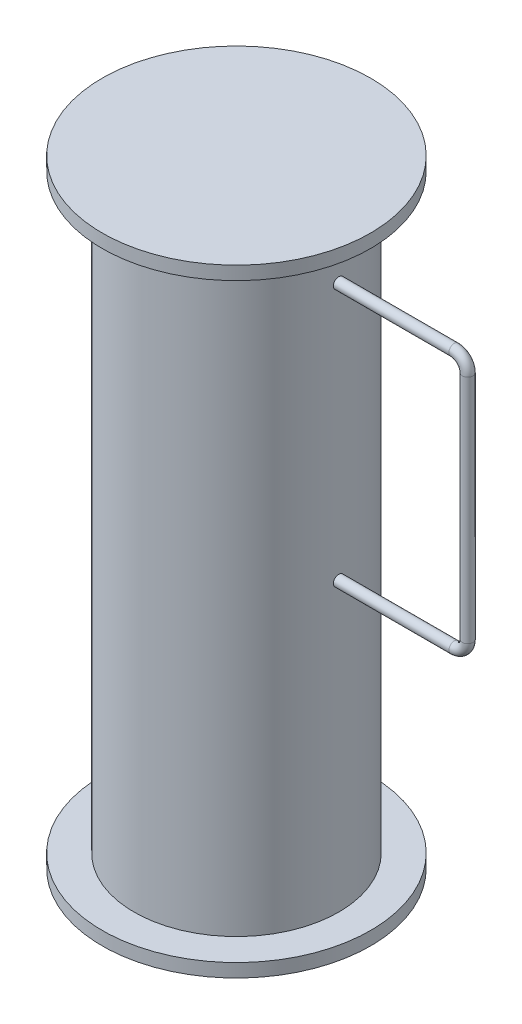
ISO-10303-21;
HEADER;
FILE_DESCRIPTION(('STEP AP214'),'2;1');
FILE_NAME('part.step','',(''),(''),'','','');
FILE_SCHEMA(('AUTOMOTIVE_DESIGN { 1 0 10303 214 1 1 1 1 }'));
ENDSEC;
DATA;
#1=APPLICATION_CONTEXT('core data for automotive mechanical design processes');
#2=APPLICATION_PROTOCOL_DEFINITION('international standard','automotive_design',2000,#1);
#3=PRODUCT_CONTEXT('',#1,'mechanical');
#4=PRODUCT('Part','Part','',(#3));
#5=PRODUCT_RELATED_PRODUCT_CATEGORY('part','',(#4));
#6=PRODUCT_DEFINITION_FORMATION('','',#4);
#7=PRODUCT_DEFINITION_CONTEXT('part definition',#1,'design');
#8=PRODUCT_DEFINITION('design','',#6,#7);
#9=PRODUCT_DEFINITION_SHAPE('','',#8);
#10=(LENGTH_UNIT() NAMED_UNIT(*) SI_UNIT(.MILLI.,.METRE.));
#11=(NAMED_UNIT(*) PLANE_ANGLE_UNIT() SI_UNIT($,.RADIAN.));
#12=(NAMED_UNIT(*) SI_UNIT($,.STERADIAN.) SOLID_ANGLE_UNIT());
#13=UNCERTAINTY_MEASURE_WITH_UNIT(LENGTH_MEASURE(1.E-05),#10,'distance_accuracy_value','');
#14=(GEOMETRIC_REPRESENTATION_CONTEXT(3) GLOBAL_UNCERTAINTY_ASSIGNED_CONTEXT((#13)) GLOBAL_UNIT_ASSIGNED_CONTEXT((#10,
#11,#12)) REPRESENTATION_CONTEXT('',''));
#15=CARTESIAN_POINT('',(0.,0.,0.));
#16=DIRECTION('',(0.,0.,1.));
#17=DIRECTION('',(1.,0.,0.));
#18=AXIS2_PLACEMENT_3D('',#15,#16,#17);
#19=CARTESIAN_POINT('',(-38.15,200.,0.));
#20=DIRECTION('',(1.,0.,0.));
#21=DIRECTION('',(0.,0.,1.));
#22=AXIS2_PLACEMENT_3D('',#19,#20,#21);
#23=PLANE('',#22);
#24=CARTESIAN_POINT('',(-38.15,200.,0.));
#25=DIRECTION('',(1.,0.,0.));
#26=DIRECTION('',(0.,0.,1.));
#27=AXIS2_PLACEMENT_3D('',#24,#25,#26);
#28=CIRCLE('',#27,2.);
#29=CARTESIAN_POINT('',(-38.15,200.,2.));
#30=VERTEX_POINT('',#29);
#31=EDGE_CURVE('E66',#30,#30,#28,.T.);
#32=ORIENTED_EDGE('',*,*,#31,.T.);
#33=EDGE_LOOP('',(#32));
#34=FACE_BOUND('',#33,.T.);
#35=ADVANCED_FACE('F54',(#34),#23,.T.);
#36=CARTESIAN_POINT('',(-38.15,180.,0.));
#37=DIRECTION('',(-1.,0.,0.));
#38=DIRECTION('',(0.,0.,1.));
#39=AXIS2_PLACEMENT_3D('',#36,#37,#38);
#40=PLANE('',#39);
#41=CARTESIAN_POINT('',(-38.15,180.,0.));
#42=DIRECTION('',(-1.,0.,0.));
#43=DIRECTION('',(0.,0.,1.));
#44=AXIS2_PLACEMENT_3D('',#41,#42,#43);
#45=CIRCLE('',#44,2.);
#46=CARTESIAN_POINT('',(-38.15,180.,2.));
#47=VERTEX_POINT('',#46);
#48=EDGE_CURVE('E13',#47,#47,#45,.T.);
#49=ORIENTED_EDGE('',*,*,#48,.F.);
#50=EDGE_LOOP('',(#49));
#51=FACE_BOUND('',#50,.T.);
#52=ADVANCED_FACE('F72',(#51),#40,.F.);
#53=CARTESIAN_POINT('',(-38.15,200.,0.));
#54=DIRECTION('',(-1.,0.,0.));
#55=DIRECTION('',(0.,-1.,0.));
#56=AXIS2_PLACEMENT_3D('',#53,#54,#55);
#57=CYLINDRICAL_SURFACE('',#56,2.);
#58=CARTESIAN_POINT('',(-48.15,200.,0.));
#59=DIRECTION('',(1.,0.,0.));
#60=DIRECTION('',(0.,0.,1.));
#61=AXIS2_PLACEMENT_3D('',#58,#59,#60);
#62=CIRCLE('',#61,2.);
#63=CARTESIAN_POINT('',(-48.15,202.,0.));
#64=VERTEX_POINT('',#63);
#65=EDGE_CURVE('E97',#64,#64,#62,.T.);
#66=ORIENTED_EDGE('',*,*,#65,.T.);
#67=EDGE_LOOP('',(#66));
#68=FACE_BOUND('',#67,.T.);
#69=ORIENTED_EDGE('',*,*,#31,.F.);
#70=EDGE_LOOP('',(#69));
#71=FACE_BOUND('',#70,.T.);
#72=ADVANCED_FACE('F74',(#68,#71),#57,.T.);
#73=CARTESIAN_POINT('',(-48.15,190.,0.));
#74=DIRECTION('',(0.,0.,1.));
#75=DIRECTION('',(1.,0.,0.));
#76=AXIS2_PLACEMENT_3D('',#73,#74,#75);
#77=TOROIDAL_SURFACE('',#76,10.,2.);
#78=CARTESIAN_POINT('',(-48.1500000000004,180.,0.));
#79=DIRECTION('',(-1.,0.,0.));
#80=DIRECTION('',(0.,0.,1.));
#81=AXIS2_PLACEMENT_3D('',#78,#79,#80);
#82=CIRCLE('',#81,2.);
#83=CARTESIAN_POINT('',(-48.1500000000005,178.,0.));
#84=VERTEX_POINT('',#83);
#85=EDGE_CURVE('E61',#84,#84,#82,.T.);
#86=CARTESIAN_POINT('',(-48.15,190.,0.));
#87=DIRECTION('',(0.,0.,1.));
#88=DIRECTION('',(1.,0.,0.));
#89=AXIS2_PLACEMENT_3D('',#86,#87,#88);
#90=CIRCLE('',#89,12.);
#91=EDGE_CURVE('',#64,#84,#90,.T.);
#92=ORIENTED_EDGE('',*,*,#65,.F.);
#93=ORIENTED_EDGE('',*,*,#85,.T.);
#94=ORIENTED_EDGE('',*,*,#91,.T.);
#95=ORIENTED_EDGE('',*,*,#91,.F.);
#96=EDGE_LOOP('',(#92,#94,#93,#95));
#97=FACE_BOUND('',#96,.T.);
#98=ADVANCED_FACE('F79',(#97),#77,.T.);
#99=CARTESIAN_POINT('',(-48.15,180.,0.));
#100=DIRECTION('',(1.,0.,0.));
#101=DIRECTION('',(0.,0.,-1.));
#102=AXIS2_PLACEMENT_3D('',#99,#100,#101);
#103=CYLINDRICAL_SURFACE('',#102,2.);
#104=ORIENTED_EDGE('',*,*,#48,.T.);
#105=EDGE_LOOP('',(#104));
#106=FACE_BOUND('',#105,.T.);
#107=ORIENTED_EDGE('',*,*,#85,.F.);
#108=EDGE_LOOP('',(#107));
#109=FACE_BOUND('',#108,.T.);
#110=ADVANCED_FACE('F69',(#106,#109),#103,.T.);
#111=CLOSED_SHELL('',(#35,#52,#72,#98,#110));
#112=MANIFOLD_SOLID_BREP('B2',#111);
#113=CARTESIAN_POINT('',(0.,0.,0.));
#114=DIRECTION('',(0.,-1.,0.));
#115=DIRECTION('',(0.,0.,-1.));
#116=AXIS2_PLACEMENT_3D('',#113,#114,#115);
#117=CYLINDRICAL_SURFACE('',#116,38.15);
#118=CARTESIAN_POINT('',(38.15,110.,0.));
#119=CARTESIAN_POINT('',(38.1499992993985,110.000004951731,0.112258148685077));
#120=CARTESIAN_POINT('',(38.149499207453,110.009483165388,0.22459572954906));
#121=CARTESIAN_POINT('',(38.1475523185728,110.047158934401,0.446171383502218));
#122=CARTESIAN_POINT('',(38.146104408624,110.075378498124,0.555405654855379));
#123=CARTESIAN_POINT('',(38.1424257484339,110.149726333528,0.76753292154806));
#124=CARTESIAN_POINT('',(38.1401953996838,110.195845421755,0.87042913734669));
#125=CARTESIAN_POINT('',(38.1352029930976,110.304668904109,1.0669918329576));
#126=CARTESIAN_POINT('',(38.1324410601568,110.367369403742,1.16066047297956));
#127=CARTESIAN_POINT('',(38.1266927567493,110.507652119338,1.33623951081285));
#128=CARTESIAN_POINT('',(38.1237061731681,110.585248577425,1.41813852349931));
#129=CARTESIAN_POINT('',(38.1178470084383,110.75309187874,1.56775639641275));
#130=CARTESIAN_POINT('',(38.1149744319692,110.843339240542,1.6354746750725));
#131=CARTESIAN_POINT('',(38.1096656733204,111.033983401005,1.75484106769072));
#132=CARTESIAN_POINT('',(38.1072297365196,111.134385857275,1.80648015754536));
#133=CARTESIAN_POINT('',(38.1030715876673,111.342450360097,1.89216447140918));
#134=CARTESIAN_POINT('',(38.1013493698017,111.450112347504,1.92620983874255));
#135=CARTESIAN_POINT('',(38.0988148213587,111.66953386995,1.97570984629501));
#136=CARTESIAN_POINT('',(38.0980016477617,111.781289509144,1.99118171199299));
#137=CARTESIAN_POINT('',(38.0973743585714,112.005814447169,2.00314867927228));
#138=CARTESIAN_POINT('',(38.0975602344886,112.118583737378,1.99964394210901));
#139=CARTESIAN_POINT('',(38.0989092999511,112.341817736564,1.97377152757986));
#140=CARTESIAN_POINT('',(38.1000715249619,112.452284609763,1.95142246642401));
#141=CARTESIAN_POINT('',(38.1032407786439,112.667896635843,1.88852466563318));
#142=CARTESIAN_POINT('',(38.1052478111492,112.77304176457,1.84797584340078));
#143=CARTESIAN_POINT('',(38.1098815867728,112.975085563919,1.74980831446508));
#144=CARTESIAN_POINT('',(38.1125086376132,113.071980107084,1.69218112793573));
#145=CARTESIAN_POINT('',(38.1180860505435,113.254727115159,1.56149886585028));
#146=CARTESIAN_POINT('',(38.1210364151542,113.340579493965,1.48844367000317));
#147=CARTESIAN_POINT('',(38.1269322156884,113.498913484652,1.32887413997164));
#148=CARTESIAN_POINT('',(38.1298776413825,113.571378852894,1.24234368655388));
#149=CARTESIAN_POINT('',(38.1354281697442,113.700756605569,1.05833654795718));
#150=CARTESIAN_POINT('',(38.1380332723227,113.757668985926,0.960859859908013));
#151=CARTESIAN_POINT('',(38.142609692942,113.854323704403,0.757717692900043));
#152=CARTESIAN_POINT('',(38.144580989744,113.89406546715,0.652051939671517));
#153=CARTESIAN_POINT('',(38.1476673313215,113.955240169134,0.435535352678438));
#154=CARTESIAN_POINT('',(38.1487823831408,113.976673258984,0.324684561575481));
#155=CARTESIAN_POINT('',(38.1500296642226,114.00060216922,0.101085547634998));
#156=CARTESIAN_POINT('',(38.1501630594521,114.003120455822,-0.0116602647206608));
#157=CARTESIAN_POINT('',(38.1494350905306,113.989206916625,-0.235972833257903));
#158=CARTESIAN_POINT('',(38.1485737300022,113.972775159835,-0.347539593731743));
#159=CARTESIAN_POINT('',(38.1459540085655,113.921446567151,-0.566264074884137));
#160=CARTESIAN_POINT('',(38.1441961464192,113.886559998053,-0.673424211371209));
#161=CARTESIAN_POINT('',(38.1399813070339,113.799322494233,-0.880368005452287));
#162=CARTESIAN_POINT('',(38.137524325368,113.746971448926,-0.98015161633387));
#163=CARTESIAN_POINT('',(38.1321846830358,113.626233585456,-1.16961297710345));
#164=CARTESIAN_POINT('',(38.1293016237997,113.557831717122,-1.2592811245866));
#165=CARTESIAN_POINT('',(38.1234358049953,113.406955859806,-1.42586963909338));
#166=CARTESIAN_POINT('',(38.1204530447272,113.324481772056,-1.50278991663639));
#167=CARTESIAN_POINT('',(38.1147206743867,113.147705915324,-1.64177492607588));
#168=CARTESIAN_POINT('',(38.1119712942391,113.053392704084,-1.70382511526345));
#169=CARTESIAN_POINT('',(38.1070193448234,112.855673565821,-1.81120916296373));
#170=CARTESIAN_POINT('',(38.1048167729992,112.752267681305,-1.85654309961924));
#171=CARTESIAN_POINT('',(38.1012084615101,112.539352253302,-1.92918245144076));
#172=CARTESIAN_POINT('',(38.0998023130581,112.429845872832,-1.95649711670216));
#173=CARTESIAN_POINT('',(38.0979442696772,112.207793732481,-1.99235280874951));
#174=CARTESIAN_POINT('',(38.0974923686169,112.095247992134,-2.00089395616323));
#175=CARTESIAN_POINT('',(38.0975939306772,111.870456618204,-1.99895902166349));
#176=CARTESIAN_POINT('',(38.0981461844963,111.758210786455,-1.98850581462103));
#177=CARTESIAN_POINT('',(38.1001912584329,111.537070085528,-1.94892621026606));
#178=CARTESIAN_POINT('',(38.1016840803291,111.428175222687,-1.91979977764154));
#179=CARTESIAN_POINT('',(38.1054417650773,111.216823073362,-1.84370528842257));
#180=CARTESIAN_POINT('',(38.1077066319461,111.114365820375,-1.79673713900031));
#181=CARTESIAN_POINT('',(38.1127530795484,110.918789343397,-1.68629622147943));
#182=CARTESIAN_POINT('',(38.1155346448645,110.825669840913,-1.62282394580986));
#183=CARTESIAN_POINT('',(38.1213048344701,110.651297492004,-1.48109392959055));
#184=CARTESIAN_POINT('',(38.1242936818809,110.570057734815,-1.40282009496846));
#185=CARTESIAN_POINT('',(38.1301399228911,110.421845792055,-1.2337222635245));
#186=CARTESIAN_POINT('',(38.1329972840026,110.354877117926,-1.14289518698329));
#187=CARTESIAN_POINT('',(38.1382607233009,110.237073873706,-0.951192199062935));
#188=CARTESIAN_POINT('',(38.1406663441514,110.186255618455,-0.850306260677778));
#189=CARTESIAN_POINT('',(38.14474854063,110.102339784369,-0.641496663967942));
#190=CARTESIAN_POINT('',(38.1464259756478,110.069221305894,-0.533581475430962));
#191=CARTESIAN_POINT('',(38.1484198332582,110.030318205232,-0.354164664958992));
#192=CARTESIAN_POINT('',(38.1490097864502,110.018963426225,-0.283824749990759));
#193=CARTESIAN_POINT('',(38.1498000917629,110.003802757226,-0.142333868945857));
#194=CARTESIAN_POINT('',(38.1500004442515,109.999996860107,-0.0711829036349616));
#195=CARTESIAN_POINT('',(38.15,110.,0.));
#196=B_SPLINE_CURVE_WITH_KNOTS('',3,(#118,#119,#120,#121,#122,#123,#124,#125,#126,#127,#128,
#129,#130,#131,#132,#133,#134,#135,#136,#137,#138,#139,#140,#141,#142,#143,#144,#145,#146,#147,
#148,#149,#150,#151,#152,#153,#154,#155,#156,#157,#158,#159,#160,#161,#162,#163,#164,#165,#166,
#167,#168,#169,#170,#171,#172,#173,#174,#175,#176,#177,#178,#179,#180,#181,#182,#183,#184,#185,
#186,#187,#188,#189,#190,#191,#192,#193,#194,#195),.UNSPECIFIED.,.T.,.F.,(4,2,2,2,2,2,2,2,2,2,2,
2,2,2,2,2,2,2,2,2,2,2,2,2,2,2,2,2,2,2,2,2,2,2,2,2,2,2,4),(0.,0.336514599151189,
0.673425074995716,1.01016292498945,1.34682175513112,1.68380408477443,2.02080023172187,
2.35798517113118,2.695167363679,3.03203660377209,3.3689029812924,3.7054369596403,
4.04197246532271,4.37867534988405,4.71538085978857,5.05249227852968,5.38960378566563,
5.7267265882876,6.06384661760918,6.40056616637654,6.73728448891729,7.07381568473355,
7.41034901147729,7.74719916101586,8.08405167489371,8.42123229288612,8.75841133465418,
9.09541715241714,9.43242080476918,9.76901887310852,10.1056175779738,10.4422180341363,
10.7788084483965,11.1157669716837,11.4528083091039,11.7901890448426,12.1271705211739,
12.3405546645855,12.5539386065418),.UNSPECIFIED.);
#197=CARTESIAN_POINT('',(38.15,110.,0.));
#198=VERTEX_POINT('',#197);
#199=EDGE_CURVE('E155',#198,#198,#196,.T.);
#200=ORIENTED_EDGE('',*,*,#199,.T.);
#201=EDGE_LOOP('',(#200));
#202=FACE_BOUND('',#201,.T.);
#203=CARTESIAN_POINT('',(0.,225.,0.));
#204=DIRECTION('',(0.,-1.,0.));
#205=DIRECTION('',(0.,0.,-1.));
#206=AXIS2_PLACEMENT_3D('',#203,#204,#205);
#207=CIRCLE('',#206,38.15);
#208=CARTESIAN_POINT('',(0.,225.,-38.15));
#209=VERTEX_POINT('',#208);
#210=EDGE_CURVE('E226',#209,#209,#207,.T.);
#211=ORIENTED_EDGE('',*,*,#210,.T.);
#212=EDGE_LOOP('',(#211));
#213=FACE_BOUND('',#212,.T.);
#214=CARTESIAN_POINT('',(0.,5.,0.));
#215=DIRECTION('',(0.,-1.,0.));
#216=DIRECTION('',(0.,0.,-1.));
#217=AXIS2_PLACEMENT_3D('',#214,#215,#216);
#218=CIRCLE('',#217,38.15);
#219=CARTESIAN_POINT('',(0.,5.,-38.15));
#220=VERTEX_POINT('',#219);
#221=EDGE_CURVE('E230',#220,#220,#218,.T.);
#222=ORIENTED_EDGE('',*,*,#221,.F.);
#223=EDGE_LOOP('',(#222));
#224=FACE_BOUND('',#223,.T.);
#225=CARTESIAN_POINT('',(38.0975392906156,208.,2.));
#226=CARTESIAN_POINT('',(38.0975399948263,207.887741970852,1.99999504816069));
#227=CARTESIAN_POINT('',(38.0980407925471,207.775404509119,1.99051685400627));
#228=CARTESIAN_POINT('',(38.0999902029231,207.553829102703,1.95284116950704));
#229=CARTESIAN_POINT('',(38.1014399299205,207.444594959849,1.92462167038953));
#230=CARTESIAN_POINT('',(38.1051225335858,207.232467964782,1.85027402400645));
#231=CARTESIAN_POINT('',(38.1073550084675,207.129571891022,1.80415506327721));
#232=CARTESIAN_POINT('',(38.1123510466893,206.933009433062,1.69533188110142));
#233=CARTESIAN_POINT('',(38.1151144852895,206.839340888833,1.63263155383274));
#234=CARTESIAN_POINT('',(38.1208645301391,206.663761741439,1.49234901176815));
#235=CARTESIAN_POINT('',(38.1238513488464,206.581862554073,1.41475251639697));
#236=CARTESIAN_POINT('',(38.1297096016061,206.432244344425,1.24690906735961));
#237=CARTESIAN_POINT('',(38.1325810309268,206.364525903175,1.15666159559383));
#238=CARTESIAN_POINT('',(38.1378866097205,206.24515934162,0.96601734016832));
#239=CARTESIAN_POINT('',(38.1403205141441,206.193520215256,0.865614917797666));
#240=CARTESIAN_POINT('',(38.144474610095,206.107835824522,0.657550488688036));
#241=CARTESIAN_POINT('',(38.1461948074186,206.073790417269,0.549888540913092));
#242=CARTESIAN_POINT('',(38.148726215594,206.024290324692,0.330467134183038));
#243=CARTESIAN_POINT('',(38.1495382687752,206.008818410947,0.218711571722132));
#244=CARTESIAN_POINT('',(38.1501647076481,205.996851320994,-0.00581321647656272));
#245=CARTESIAN_POINT('',(38.1499791017907,206.000355984037,-0.11858243361976));
#246=CARTESIAN_POINT('',(38.1486318461446,206.026228282394,-0.341816762844075));
#247=CARTESIAN_POINT('',(38.1474711557766,206.048577376077,-0.452284030445118));
#248=CARTESIAN_POINT('',(38.144305562587,206.111475379093,-0.667896828575677));
#249=CARTESIAN_POINT('',(38.1423006559678,206.152024370298,-0.773042335162904));
#250=CARTESIAN_POINT('',(38.1376707997325,206.250192246665,-0.975086587975669));
#251=CARTESIAN_POINT('',(38.1350455436742,206.307819571824,-1.07198122612653));
#252=CARTESIAN_POINT('',(38.129470599053,206.438502128485,-1.25472836514684));
#253=CARTESIAN_POINT('',(38.1265209079587,206.511557480365,-1.34058077985119));
#254=CARTESIAN_POINT('',(38.12062504578,206.671127119631,-1.49891458990218));
#255=CARTESIAN_POINT('',(38.1176788832009,206.757657494767,-1.571379773237));
#256=CARTESIAN_POINT('',(38.1121257846851,206.941664411385,-1.70075719035232));
#257=CARTESIAN_POINT('',(38.1095188488455,207.039140955999,-1.75766941968317));
#258=CARTESIAN_POINT('',(38.1049384628747,207.24228308724,-1.85432403004092));
#259=CARTESIAN_POINT('',(38.1029650357134,207.347948970622,-1.89406578852103));
#260=CARTESIAN_POINT('',(38.0998750790917,207.564465840053,-1.95524044195294));
#261=CARTESIAN_POINT('',(38.0987585425463,207.675316783223,-1.97667348828848));
#262=CARTESIAN_POINT('',(38.0975095931999,207.898915862966,-2.00060223489));
#263=CARTESIAN_POINT('',(38.0973760107434,208.01166158462,-2.00312044273314));
#264=CARTESIAN_POINT('',(38.0981049797962,208.235973952724,-1.98920677840553));
#265=CARTESIAN_POINT('',(38.0989675276782,208.347540603467,-1.97277497523773));
#266=CARTESIAN_POINT('',(38.1015904747927,208.566264563742,-1.92144640009853));
#267=CARTESIAN_POINT('',(38.1033503725251,208.673424300049,-1.88655994143768));
#268=CARTESIAN_POINT('',(38.1075692419591,208.880367342764,-1.79932279282381));
#269=CARTESIAN_POINT('',(38.1100282181131,208.980150602188,-1.7469719916416));
#270=CARTESIAN_POINT('',(38.1153709481457,209.169611731118,-1.62623448314941));
#271=CARTESIAN_POINT('',(38.1182551013779,209.259279958628,-1.55783266355733));
#272=CARTESIAN_POINT('',(38.1241217182088,209.42586865737,-1.40695685848432));
#273=CARTESIAN_POINT('',(38.1271041824949,209.502789039462,-1.32448277461157));
#274=CARTESIAN_POINT('',(38.1328346998303,209.641774263972,-1.14770687069211));
#275=CARTESIAN_POINT('',(38.1355825217198,209.703824563263,-1.05339360800321));
#276=CARTESIAN_POINT('',(38.1405307745148,209.811208804374,-0.855674338509704));
#277=CARTESIAN_POINT('',(38.1427312079792,209.856542824345,-0.752268374216582));
#278=CARTESIAN_POINT('',(38.1463355986374,209.92918223371,-0.539353005392184));
#279=CARTESIAN_POINT('',(38.1477399660251,209.956496909235,-0.429846776189379));
#280=CARTESIAN_POINT('',(38.149595590497,209.992352673104,-0.207794953986326));
#281=CARTESIAN_POINT('',(38.1500468536646,210.000893881275,-0.0952493803901696));
#282=CARTESIAN_POINT('',(38.1499454400814,209.998959119373,0.129542106563804));
#283=CARTESIAN_POINT('',(38.1493939671023,209.988505951813,0.241788217439245));
#284=CARTESIAN_POINT('',(38.1473515267832,209.948926328008,0.462929486200073));
#285=CARTESIAN_POINT('',(38.1458605576918,209.919799836953,0.571824637838062));
#286=CARTESIAN_POINT('',(38.1421068396264,209.843705127064,0.783177349547494));
#287=CARTESIAN_POINT('',(38.1398440866266,209.796736815161,0.885634876034489));
#288=CARTESIAN_POINT('',(38.1348012028366,209.686295488391,1.08121183187847));
#289=CARTESIAN_POINT('',(38.1320210874928,209.622822966249,1.17433153989644));
#290=CARTESIAN_POINT('',(38.1262525120928,209.481092684108,1.34870386448463));
#291=CARTESIAN_POINT('',(38.1232638282775,209.402818886032,1.42994343728422));
#292=CARTESIAN_POINT('',(38.1174165441432,209.233721202817,1.57815502514689));
#293=CARTESIAN_POINT('',(38.1145579759798,209.142894237559,1.64512352829361));
#294=CARTESIAN_POINT('',(38.1092912733761,208.951191335029,1.76292659437007));
#295=CARTESIAN_POINT('',(38.1068835963282,208.850305350933,1.81374481017243));
#296=CARTESIAN_POINT('',(38.1027973520869,208.641495656254,1.897660557729));
#297=CARTESIAN_POINT('',(38.1011179254053,208.533580415716,1.93077898973655));
#298=CARTESIAN_POINT('',(38.0991215746506,208.354163730161,1.96968195567733));
#299=CARTESIAN_POINT('',(38.0985308410784,208.283824001629,1.98103667415717));
#300=CARTESIAN_POINT('',(38.0977394759762,208.142333494348,1.99619726271694));
#301=CARTESIAN_POINT('',(38.0975388440762,208.071182716367,2.0000031399569));
#302=CARTESIAN_POINT('',(38.0975392906156,208.,2.));
#303=B_SPLINE_CURVE_WITH_KNOTS('',3,(#225,#226,#227,#228,#229,#230,#231,#232,#233,#234,#235,
#236,#237,#238,#239,#240,#241,#242,#243,#244,#245,#246,#247,#248,#249,#250,#251,#252,#253,#254,
#255,#256,#257,#258,#259,#260,#261,#262,#263,#264,#265,#266,#267,#268,#269,#270,#271,#272,#273,
#274,#275,#276,#277,#278,#279,#280,#281,#282,#283,#284,#285,#286,#287,#288,#289,#290,#291,#292,
#293,#294,#295,#296,#297,#298,#299,#300,#301,#302),.UNSPECIFIED.,.T.,.F.,(4,2,2,2,2,2,2,2,2,2,2,
2,2,2,2,2,2,2,2,2,2,2,2,2,2,2,2,2,2,2,2,2,2,2,2,2,2,2,4),(0.,0.336514240149059,0.67342436482369,
1.01016180536405,1.34682023234775,1.68380303162751,2.02079963550854,2.35798440069515,
2.69516642749624,3.03203544838864,3.36890161571925,3.70543671602975,4.04197333025733,
4.37867653675944,4.71538237047781,5.05249332155354,5.38960436907553,5.72672763814892,
6.06384811972531,6.40056738354153,6.73728542126085,7.07381548393384,7.41034768998414,
7.74719802669204,8.08405071871928,8.42123152456504,8.7584107540589,9.09541608481035,
9.43241926452636,9.76901814335259,10.1056176496826,10.4422189118729,10.7788101261521,
11.1157681692335,11.4528090375998,11.7901899761076,12.1271716433779,12.3405552259352,
12.5539386060997),.UNSPECIFIED.);
#304=CARTESIAN_POINT('',(38.0975392906156,208.,2.));
#305=VERTEX_POINT('',#304);
#306=EDGE_CURVE('E53',#305,#305,#303,.T.);
#307=ORIENTED_EDGE('',*,*,#306,.F.);
#308=EDGE_LOOP('',(#307));
#309=FACE_BOUND('',#308,.T.);
#310=ADVANCED_FACE('F127',(#202,#213,#224,#309),#117,.T.);
#311=CARTESIAN_POINT('',(0.,0.,0.));
#312=DIRECTION('',(0.,-1.,0.));
#313=DIRECTION('',(0.,0.,-1.));
#314=AXIS2_PLACEMENT_3D('',#311,#312,#313);
#315=PLANE('',#314);
#316=CARTESIAN_POINT('',(0.,0.,0.));
#317=DIRECTION('',(0.,-1.,0.));
#318=DIRECTION('',(0.,0.,-1.));
#319=AXIS2_PLACEMENT_3D('',#316,#317,#318);
#320=CIRCLE('',#319,50.);
#321=CARTESIAN_POINT('',(0.,0.,-50.));
#322=VERTEX_POINT('',#321);
#323=EDGE_CURVE('E145',#322,#322,#320,.T.);
#324=ORIENTED_EDGE('',*,*,#323,.T.);
#325=EDGE_LOOP('',(#324));
#326=FACE_BOUND('',#325,.T.);
#327=ADVANCED_FACE('F129',(#326),#315,.T.);
#328=CARTESIAN_POINT('',(0.,0.,0.));
#329=DIRECTION('',(0.,-1.,0.));
#330=DIRECTION('',(0.,0.,-1.));
#331=AXIS2_PLACEMENT_3D('',#328,#329,#330);
#332=CYLINDRICAL_SURFACE('',#331,50.);
#333=CARTESIAN_POINT('',(0.,5.,0.));
#334=DIRECTION('',(0.,-1.,0.));
#335=DIRECTION('',(0.,0.,-1.));
#336=AXIS2_PLACEMENT_3D('',#333,#334,#335);
#337=CIRCLE('',#336,50.);
#338=CARTESIAN_POINT('',(0.,5.,-50.));
#339=VERTEX_POINT('',#338);
#340=EDGE_CURVE('E231',#339,#339,#337,.T.);
#341=ORIENTED_EDGE('',*,*,#340,.T.);
#342=EDGE_LOOP('',(#341));
#343=FACE_BOUND('',#342,.T.);
#344=ORIENTED_EDGE('',*,*,#323,.F.);
#345=EDGE_LOOP('',(#344));
#346=FACE_BOUND('',#345,.T.);
#347=ADVANCED_FACE('F211',(#343,#346),#332,.T.);
#348=CARTESIAN_POINT('',(0.,5.,0.));
#349=DIRECTION('',(0.,1.,0.));
#350=DIRECTION('',(0.,0.,1.));
#351=AXIS2_PLACEMENT_3D('',#348,#349,#350);
#352=PLANE('',#351);
#353=ORIENTED_EDGE('',*,*,#221,.T.);
#354=EDGE_LOOP('',(#353));
#355=FACE_BOUND('',#354,.T.);
#356=ORIENTED_EDGE('',*,*,#340,.F.);
#357=EDGE_LOOP('',(#356));
#358=FACE_BOUND('',#357,.T.);
#359=ADVANCED_FACE('F206',(#355,#358),#352,.T.);
#360=CARTESIAN_POINT('',(-5.27004600296751E-13,225.,0.));
#361=DIRECTION('',(0.,1.,0.));
#362=DIRECTION('',(0.,0.,1.));
#363=AXIS2_PLACEMENT_3D('',#360,#361,#362);
#364=PLANE('',#363);
#365=ORIENTED_EDGE('',*,*,#210,.F.);
#366=EDGE_LOOP('',(#365));
#367=FACE_BOUND('',#366,.T.);
#368=CARTESIAN_POINT('',(0.,225.,0.));
#369=DIRECTION('',(0.,-1.,0.));
#370=DIRECTION('',(0.,0.,-1.));
#371=AXIS2_PLACEMENT_3D('',#368,#369,#370);
#372=CIRCLE('',#371,50.);
#373=CARTESIAN_POINT('',(0.,225.,-50.));
#374=VERTEX_POINT('',#373);
#375=EDGE_CURVE('E234',#374,#374,#372,.T.);
#376=ORIENTED_EDGE('',*,*,#375,.T.);
#377=EDGE_LOOP('',(#376));
#378=FACE_BOUND('',#377,.T.);
#379=ADVANCED_FACE('F203',(#367,#378),#364,.F.);
#380=CARTESIAN_POINT('',(0.,0.,0.));
#381=DIRECTION('',(0.,-1.,0.));
#382=DIRECTION('',(0.,0.,-1.));
#383=AXIS2_PLACEMENT_3D('',#380,#381,#382);
#384=CYLINDRICAL_SURFACE('',#383,50.);
#385=ORIENTED_EDGE('',*,*,#375,.F.);
#386=EDGE_LOOP('',(#385));
#387=FACE_BOUND('',#386,.T.);
#388=CARTESIAN_POINT('',(0.,230.,0.));
#389=DIRECTION('',(0.,-1.,0.));
#390=DIRECTION('',(0.,0.,-1.));
#391=AXIS2_PLACEMENT_3D('',#388,#389,#390);
#392=CIRCLE('',#391,50.);
#393=CARTESIAN_POINT('',(0.,230.,-50.));
#394=VERTEX_POINT('',#393);
#395=EDGE_CURVE('E239',#394,#394,#392,.T.);
#396=ORIENTED_EDGE('',*,*,#395,.T.);
#397=EDGE_LOOP('',(#396));
#398=FACE_BOUND('',#397,.T.);
#399=ADVANCED_FACE('F200',(#387,#398),#384,.T.);
#400=CARTESIAN_POINT('',(0.,230.,0.));
#401=DIRECTION('',(0.,-1.,0.));
#402=DIRECTION('',(0.,0.,-1.));
#403=AXIS2_PLACEMENT_3D('',#400,#401,#402);
#404=PLANE('',#403);
#405=ORIENTED_EDGE('',*,*,#395,.F.);
#406=EDGE_LOOP('',(#405));
#407=FACE_BOUND('',#406,.T.);
#408=ADVANCED_FACE('F196',(#407),#404,.F.);
#409=CARTESIAN_POINT('',(81.15,112.,0.));
#410=DIRECTION('',(-1.,0.,0.));
#411=DIRECTION('',(0.,-1.,0.));
#412=AXIS2_PLACEMENT_3D('',#409,#410,#411);
#413=CYLINDRICAL_SURFACE('',#412,2.);
#414=CARTESIAN_POINT('',(81.15,112.,0.));
#415=DIRECTION('',(-1.,0.,0.));
#416=DIRECTION('',(0.,0.,-1.));
#417=AXIS2_PLACEMENT_3D('',#414,#415,#416);
#418=CIRCLE('',#417,2.);
#419=CARTESIAN_POINT('',(81.15,110.,0.));
#420=VERTEX_POINT('',#419);
#421=EDGE_CURVE('E271',#420,#420,#418,.T.);
#422=ORIENTED_EDGE('',*,*,#421,.T.);
#423=EDGE_LOOP('',(#422));
#424=FACE_BOUND('',#423,.T.);
#425=ORIENTED_EDGE('',*,*,#199,.F.);
#426=EDGE_LOOP('',(#425));
#427=FACE_BOUND('',#426,.T.);
#428=ADVANCED_FACE('F199',(#424,#427),#413,.T.);
#429=CARTESIAN_POINT('',(81.15,208.,0.));
#430=DIRECTION('',(-1.,0.,0.));
#431=DIRECTION('',(0.,0.,1.));
#432=AXIS2_PLACEMENT_3D('',#429,#430,#431);
#433=CYLINDRICAL_SURFACE('',#432,2.);
#434=CARTESIAN_POINT('',(81.15,208.,0.));
#435=DIRECTION('',(1.,0.,0.));
#436=DIRECTION('',(0.,0.,-1.));
#437=AXIS2_PLACEMENT_3D('',#434,#435,#436);
#438=CIRCLE('',#437,2.);
#439=CARTESIAN_POINT('',(81.1499999999999,210.,0.));
#440=VERTEX_POINT('',#439);
#441=EDGE_CURVE('E261',#440,#440,#438,.T.);
#442=ORIENTED_EDGE('',*,*,#441,.F.);
#443=EDGE_LOOP('',(#442));
#444=FACE_BOUND('',#443,.T.);
#445=ORIENTED_EDGE('',*,*,#306,.T.);
#446=EDGE_LOOP('',(#445));
#447=FACE_BOUND('',#446,.T.);
#448=ADVANCED_FACE('F171',(#444,#447),#433,.T.);
#449=CARTESIAN_POINT('',(81.15,117.,0.));
#450=DIRECTION('',(0.,0.,-1.));
#451=DIRECTION('',(-1.,0.,0.));
#452=AXIS2_PLACEMENT_3D('',#449,#450,#451);
#453=TOROIDAL_SURFACE('',#452,5.00000000000002,2.);
#454=CARTESIAN_POINT('',(86.15,117.,0.));
#455=DIRECTION('',(0.,-1.,0.));
#456=DIRECTION('',(0.,0.,-1.));
#457=AXIS2_PLACEMENT_3D('',#454,#455,#456);
#458=CIRCLE('',#457,2.);
#459=CARTESIAN_POINT('',(88.15,117.,0.));
#460=VERTEX_POINT('',#459);
#461=EDGE_CURVE('E269',#460,#460,#458,.T.);
#462=CARTESIAN_POINT('',(81.15,117.,0.));
#463=DIRECTION('',(0.,0.,-1.));
#464=DIRECTION('',(-1.,0.,0.));
#465=AXIS2_PLACEMENT_3D('',#462,#463,#464);
#466=CIRCLE('',#465,7.00000000000002);
#467=EDGE_CURVE('',#460,#420,#466,.T.);
#468=ORIENTED_EDGE('',*,*,#461,.T.);
#469=ORIENTED_EDGE('',*,*,#421,.F.);
#470=ORIENTED_EDGE('',*,*,#467,.T.);
#471=ORIENTED_EDGE('',*,*,#467,.F.);
#472=EDGE_LOOP('',(#468,#470,#469,#471));
#473=FACE_BOUND('',#472,.T.);
#474=ADVANCED_FACE('F291',(#473),#453,.T.);
#475=CARTESIAN_POINT('',(86.15,203.,0.));
#476=DIRECTION('',(0.,-1.,0.));
#477=DIRECTION('',(1.,0.,0.));
#478=AXIS2_PLACEMENT_3D('',#475,#476,#477);
#479=CYLINDRICAL_SURFACE('',#478,2.);
#480=CARTESIAN_POINT('',(86.15,203.,0.));
#481=DIRECTION('',(0.,-1.,0.));
#482=DIRECTION('',(0.,0.,-1.));
#483=AXIS2_PLACEMENT_3D('',#480,#481,#482);
#484=CIRCLE('',#483,2.);
#485=CARTESIAN_POINT('',(88.15,203.,0.));
#486=VERTEX_POINT('',#485);
#487=EDGE_CURVE('E264',#486,#486,#484,.T.);
#488=ORIENTED_EDGE('',*,*,#487,.T.);
#489=EDGE_LOOP('',(#488));
#490=FACE_BOUND('',#489,.T.);
#491=ORIENTED_EDGE('',*,*,#461,.F.);
#492=EDGE_LOOP('',(#491));
#493=FACE_BOUND('',#492,.T.);
#494=ADVANCED_FACE('F297',(#490,#493),#479,.T.);
#495=CARTESIAN_POINT('',(81.15,203.,0.));
#496=DIRECTION('',(0.,0.,-1.));
#497=DIRECTION('',(-1.,0.,0.));
#498=AXIS2_PLACEMENT_3D('',#495,#496,#497);
#499=TOROIDAL_SURFACE('',#498,5.,2.);
#500=CARTESIAN_POINT('',(81.15,203.,0.));
#501=DIRECTION('',(0.,0.,-1.));
#502=DIRECTION('',(-1.,0.,0.));
#503=AXIS2_PLACEMENT_3D('',#500,#501,#502);
#504=CIRCLE('',#503,7.);
#505=EDGE_CURVE('',#440,#486,#504,.T.);
#506=ORIENTED_EDGE('',*,*,#441,.T.);
#507=ORIENTED_EDGE('',*,*,#487,.F.);
#508=ORIENTED_EDGE('',*,*,#505,.T.);
#509=ORIENTED_EDGE('',*,*,#505,.F.);
#510=EDGE_LOOP('',(#506,#508,#507,#509));
#511=FACE_BOUND('',#510,.T.);
#512=ADVANCED_FACE('F174',(#511),#499,.T.);
#513=CLOSED_SHELL('',(#310,#327,#347,#359,#379,#399,#408,#428,#448,#474,#494,#512));
#514=CARTESIAN_POINT('',(0.,0.,0.));
#515=DIRECTION('',(0.,-1.,0.));
#516=DIRECTION('',(0.,0.,-1.));
#517=AXIS2_PLACEMENT_3D('',#514,#515,#516);
#518=CYLINDRICAL_SURFACE('',#517,33.15);
#519=CARTESIAN_POINT('',(33.15,110.,0.));
#520=CARTESIAN_POINT('',(33.1499991969825,110.00000494109,0.112231348558244));
#521=CARTESIAN_POINT('',(33.1494239539142,110.009478648053,0.224541471650488));
#522=CARTESIAN_POINT('',(33.147184498066,110.047135471808,0.446061129593364));
#523=CARTESIAN_POINT('',(33.1455190149018,110.075340415421,0.555266892052288));
#524=CARTESIAN_POINT('',(33.1412875074874,110.149647141618,0.767337003537712));
#525=CARTESIAN_POINT('',(33.1387219552997,110.195739544044,0.870204643559332));
#526=CARTESIAN_POINT('',(33.1329789365111,110.304497735507,1.06671582465607));
#527=CARTESIAN_POINT('',(33.1298016109103,110.367159706867,1.16036148369104));
#528=CARTESIAN_POINT('',(33.1231872512016,110.507375026237,1.33592914100705));
#529=CARTESIAN_POINT('',(33.1197499005073,110.584946710044,1.41783648486335));
#530=CARTESIAN_POINT('',(33.1130056073681,110.752741860052,1.5674772089125));
#531=CARTESIAN_POINT('',(33.1096986703537,110.842965852389,1.63520999937556));
#532=CARTESIAN_POINT('',(33.1035857180353,111.033586601353,1.75462340729437));
#533=CARTESIAN_POINT('',(33.1007800800468,111.133990932122,1.80629195505417));
#534=CARTESIAN_POINT('',(33.0959901810419,111.342069113474,1.89203293810721));
#535=CARTESIAN_POINT('',(33.0940059116858,111.449742890234,1.92610555205996));
#536=CARTESIAN_POINT('',(33.0910855094049,111.669163214326,1.97564707548851));
#537=CARTESIAN_POINT('',(33.0901480913387,111.780904593674,1.9911387970777));
#538=CARTESIAN_POINT('',(33.0894232539217,112.005405395005,2.00314919692909));
#539=CARTESIAN_POINT('',(33.0896358222949,112.118164806108,1.99966807772395));
#540=CARTESIAN_POINT('',(33.0911857931078,112.341345477265,1.97385055448613));
#541=CARTESIAN_POINT('',(33.0925217233214,112.451769603758,1.95153882883429));
#542=CARTESIAN_POINT('',(33.0961655441296,112.667302409318,1.88873171235854));
#543=CARTESIAN_POINT('',(33.0984734402237,112.772411058305,1.84823621864793));
#544=CARTESIAN_POINT('',(33.1038027959207,112.974408585277,1.75018303685707));
#545=CARTESIAN_POINT('',(33.106824723886,113.071292011064,1.69261414329444));
#546=CARTESIAN_POINT('',(33.1132411117805,113.254029314749,1.56205645935103));
#547=CARTESIAN_POINT('',(33.1166355756027,113.339883077369,1.48906750782627));
#548=CARTESIAN_POINT('',(33.1234210295904,113.49826757462,1.32960255236751));
#549=CARTESIAN_POINT('',(33.1268120055432,113.570776805805,1.24310518834684));
#550=CARTESIAN_POINT('',(33.1332031179538,113.700248134479,1.05915366765429));
#551=CARTESIAN_POINT('',(33.1362032542835,113.757210226875,0.961699507392375));
#552=CARTESIAN_POINT('',(33.1414748248272,113.853968467035,0.758587806013268));
#553=CARTESIAN_POINT('',(33.1437462249815,113.893763812488,0.652929881753926));
#554=CARTESIAN_POINT('',(33.1473038969233,113.95504460873,0.43641567258852));
#555=CARTESIAN_POINT('',(33.1485901794334,113.976530258809,0.325559444276859));
#556=CARTESIAN_POINT('',(33.1500312868998,114.000555147238,0.101982020381059));
#557=CARTESIAN_POINT('',(33.1501878874619,114.003124118482,-0.0107359692670787));
#558=CARTESIAN_POINT('',(33.1493567051978,113.989320395098,-0.235001300975069));
#559=CARTESIAN_POINT('',(33.1483689279151,113.972947792228,-0.346548648703086));
#560=CARTESIAN_POINT('',(33.1453613426446,113.921750295719,-0.565222600175852));
#561=CARTESIAN_POINT('',(33.1433422969655,113.886939031148,-0.672352406219383));
#562=CARTESIAN_POINT('',(33.1384993560162,113.799866212954,-0.879249054229602));
#563=CARTESIAN_POINT('',(33.1356754539975,113.74760451301,-0.979015834448893));
#564=CARTESIAN_POINT('',(33.1295357504643,113.627038570876,-1.16849064420814));
#565=CARTESIAN_POINT('',(33.1262193415288,113.558714456961,-1.25818600906814));
#566=CARTESIAN_POINT('',(33.1194699357435,113.407992102937,-1.42484440213881));
#567=CARTESIAN_POINT('',(33.1160369378221,113.325593733437,-1.50180731328122));
#568=CARTESIAN_POINT('',(33.1094361505901,113.148933647325,-1.6409167061601));
#569=CARTESIAN_POINT('',(33.1062687098096,113.054656734432,-1.7030439083727));
#570=CARTESIAN_POINT('',(33.1005617658052,112.856992190517,-1.81058646315838));
#571=CARTESIAN_POINT('',(33.0980222589233,112.753604612572,-1.85600191308156));
#572=CARTESIAN_POINT('',(33.0938600750118,112.540724143071,-1.92879835618502));
#573=CARTESIAN_POINT('',(33.0922367796954,112.431235423699,-1.95619151341752));
#574=CARTESIAN_POINT('',(33.0900883600638,112.209202617007,-1.99220551778677));
#575=CARTESIAN_POINT('',(33.0895632257353,112.096658557556,-2.00082653609455));
#576=CARTESIAN_POINT('',(33.0896705900073,111.871901520219,-1.9990499073575));
#577=CARTESIAN_POINT('',(33.0903012434805,111.759688300574,-1.98868257378844));
#578=CARTESIAN_POINT('',(33.0926452065599,111.538598943714,-1.94928634539699));
#579=CARTESIAN_POINT('',(33.094358518149,111.429722812612,-1.92025741639498));
#580=CARTESIAN_POINT('',(33.0986742715787,111.218393352924,-1.84436874009304));
#581=CARTESIAN_POINT('',(33.1012767098814,111.115939998784,-1.79750906374259));
#582=CARTESIAN_POINT('',(33.1070773844472,110.920351301199,-1.68729338998238));
#583=CARTESIAN_POINT('',(33.1102756047392,110.827215708077,-1.62393783475862));
#584=CARTESIAN_POINT('',(33.1169133595879,110.652752907821,-1.48241724032638));
#585=CARTESIAN_POINT('',(33.120353244724,110.571443404015,-1.40423039413143));
#586=CARTESIAN_POINT('',(33.1270837729274,110.423076365682,-1.23529391624194));
#587=CARTESIAN_POINT('',(33.1303743792364,110.356022326584,-1.14454121239438));
#588=CARTESIAN_POINT('',(33.1364387509359,110.238023701125,-0.952951950669167));
#589=CARTESIAN_POINT('',(33.1392118998277,110.187098280686,-0.852103581744224));
#590=CARTESIAN_POINT('',(33.1439204465685,110.102964578224,-0.643344999349663));
#591=CARTESIAN_POINT('',(33.1458568266464,110.069735512879,-0.53544323771056));
#592=CARTESIAN_POINT('',(33.1481653175589,110.030589329135,-0.355732820585897));
#593=CARTESIAN_POINT('',(33.1488502722769,110.019133127993,-0.285086262075606));
#594=CARTESIAN_POINT('',(33.1497678690044,110.003836894344,-0.142970459365033));
#595=CARTESIAN_POINT('',(33.1500005115926,109.999996852092,-0.0715012162175048));
#596=CARTESIAN_POINT('',(33.15,110.,0.));
#597=B_SPLINE_CURVE_WITH_KNOTS('',3,(#519,#520,#521,#522,#523,#524,#525,#526,#527,#528,#529,
#530,#531,#532,#533,#534,#535,#536,#537,#538,#539,#540,#541,#542,#543,#544,#545,#546,#547,#548,
#549,#550,#551,#552,#553,#554,#555,#556,#557,#558,#559,#560,#561,#562,#563,#564,#565,#566,#567,
#568,#569,#570,#571,#572,#573,#574,#575,#576,#577,#578,#579,#580,#581,#582,#583,#584,#585,#586,
#587,#588,#589,#590,#591,#592,#593,#594,#595,#596),.UNSPECIFIED.,.T.,.F.,(4,2,2,2,2,2,2,2,2,2,2,
2,2,2,2,2,2,2,2,2,2,2,2,2,2,2,2,2,2,2,2,2,2,2,2,2,2,2,4),(0.,0.336433026786906,
0.673258776096141,1.00990813258064,1.34647999152359,1.68346844217653,2.02047091038834,
2.357725973286,2.69497761181256,3.03181477489934,3.36864834229906,3.70504115796985,
4.04143587702976,4.37805186651564,4.71467137390797,5.05182865099479,5.38898603855285,
5.72615918192695,6.06332865531865,6.3999680584946,6.7366058309336,7.07299512172264,
7.40938723320034,7.74619772512679,8.08301131367815,8.42026024989814,8.75750722152815,
9.09452633592298,9.43154237724479,9.76802086668313,10.1044999724002,10.4409777392633,
10.7774464874837,11.1144138474234,11.4514637364858,11.7889126579975,12.1259643868116,
12.340302017779,12.5546393744982),.UNSPECIFIED.);
#598=CARTESIAN_POINT('',(33.15,110.,0.));
#599=VERTEX_POINT('',#598);
#600=EDGE_CURVE('E131',#599,#599,#597,.T.);
#601=ORIENTED_EDGE('',*,*,#600,.F.);
#602=EDGE_LOOP('',(#601));
#603=FACE_BOUND('',#602,.T.);
#604=CARTESIAN_POINT('',(0.,225.,0.));
#605=DIRECTION('',(0.,-1.,0.));
#606=DIRECTION('',(0.,0.,-1.));
#607=AXIS2_PLACEMENT_3D('',#604,#605,#606);
#608=CIRCLE('',#607,33.15);
#609=CARTESIAN_POINT('',(0.,225.,-33.15));
#610=VERTEX_POINT('',#609);
#611=EDGE_CURVE('E242',#610,#610,#608,.T.);
#612=ORIENTED_EDGE('',*,*,#611,.F.);
#613=EDGE_LOOP('',(#612));
#614=FACE_BOUND('',#613,.T.);
#615=CARTESIAN_POINT('',(0.,5.,0.));
#616=DIRECTION('',(0.,-1.,0.));
#617=DIRECTION('',(0.,0.,-1.));
#618=AXIS2_PLACEMENT_3D('',#615,#616,#617);
#619=CIRCLE('',#618,33.15);
#620=CARTESIAN_POINT('',(0.,5.,-33.15));
#621=VERTEX_POINT('',#620);
#622=EDGE_CURVE('E244',#621,#621,#619,.T.);
#623=ORIENTED_EDGE('',*,*,#622,.T.);
#624=EDGE_LOOP('',(#623));
#625=FACE_BOUND('',#624,.T.);
#626=CARTESIAN_POINT('',(33.0896131739251,208.,2.));
#627=CARTESIAN_POINT('',(33.0896139824121,207.887768861062,1.9999950587202));
#628=CARTESIAN_POINT('',(33.0901903007638,207.775458946884,1.99052138594823));
#629=CARTESIAN_POINT('',(33.0924335984459,207.553939723033,1.95286471036105));
#630=CARTESIAN_POINT('',(33.0941018501802,207.444734185915,1.92465988001228));
#631=CARTESIAN_POINT('',(33.0983393655706,207.232664550781,1.85035348518957));
#632=CARTESIAN_POINT('',(33.1009081566421,207.129797159863,1.80426130627657));
#633=CARTESIAN_POINT('',(33.1066567081195,206.93328639563,1.69550364106408));
#634=CARTESIAN_POINT('',(33.1098363277622,206.839640904671,1.63284197188926));
#635=CARTESIAN_POINT('',(33.1164533459501,206.664073055437,1.49262695688048));
#636=CARTESIAN_POINT('',(33.1198910598268,206.582165405332,1.41505520782576));
#637=CARTESIAN_POINT('',(33.1266339721696,206.432524090828,1.24725979902598));
#638=CARTESIAN_POINT('',(33.1299391651264,206.364791015221,1.15703561397677));
#639=CARTESIAN_POINT('',(33.1360472740397,206.245377310786,0.966414698278847));
#640=CARTESIAN_POINT('',(33.1388498133311,206.193708698822,0.866010426609724));
#641=CARTESIAN_POINT('',(33.143633531395,206.107967580734,0.657932373764225));
#642=CARTESIAN_POINT('',(33.1456147184708,206.073894896726,0.550258666089844));
#643=CARTESIAN_POINT('',(33.1485303302345,206.024353224448,0.330838544920138));
#644=CARTESIAN_POINT('',(33.1494660386778,206.008861418779,0.219097300567763));
#645=CARTESIAN_POINT('',(33.1501895776776,205.996850804003,-0.00540323707951965));
#646=CARTESIAN_POINT('',(33.1499774204336,206.000331793255,-0.118162519542075));
#647=CARTESIAN_POINT('',(33.1484302073669,206.02614911255,-0.341343768651528));
#648=CARTESIAN_POINT('',(33.147096613445,206.048460894975,-0.451768586473655));
#649=CARTESIAN_POINT('',(33.143458365041,206.111268365339,-0.66730274544121));
#650=CARTESIAN_POINT('',(33.1411537051322,206.151764154896,-0.772412056878057));
#651=CARTESIAN_POINT('',(33.1358303194483,206.249817945522,-0.974410379859688));
#652=CARTESIAN_POINT('',(33.1328111278908,206.307387082431,-1.07129397308687));
#653=CARTESIAN_POINT('',(33.126398506793,206.437945283757,-1.25403150809268));
#654=CARTESIAN_POINT('',(33.1230050733384,206.510934509465,-1.33988533448694));
#655=CARTESIAN_POINT('',(33.1162195380099,206.670399657192,-1.49826951530671));
#656=CARTESIAN_POINT('',(33.1128274468736,206.756896883888,-1.57077842183732));
#657=CARTESIAN_POINT('',(33.1064324294131,206.940848014963,-1.70024916123713));
#658=CARTESIAN_POINT('',(33.1034295032327,207.038301923392,-1.75721098835756));
#659=CARTESIAN_POINT('',(33.0981518888676,207.241413561286,-1.85396903849781));
#660=CARTESIAN_POINT('',(33.0958772382321,207.347071713406,-1.89376437646533));
#661=CARTESIAN_POINT('',(33.0923140478822,207.563586417141,-1.95504508770209));
#662=CARTESIAN_POINT('',(33.0910254973618,207.674442911777,-1.9765306616158));
#663=CARTESIAN_POINT('',(33.0895818399443,207.898020452002,-2.00055526350976));
#664=CARTESIAN_POINT('',(33.0894249500131,208.010738283858,-2.00312409666865));
#665=CARTESIAN_POINT('',(33.090257649183,208.235003266642,-1.98932015345669));
#666=CARTESIAN_POINT('',(33.0912472327309,208.346550423238,-1.9729474688316));
#667=CARTESIAN_POINT('',(33.0942597277999,208.565223462225,-1.92175000188522));
#668=CARTESIAN_POINT('',(33.0962818714663,208.672352566175,-1.88693893039828));
#669=CARTESIAN_POINT('',(33.101130948138,208.879247895629,-1.79986673398557));
#670=CARTESIAN_POINT('',(33.1039578879437,208.979014058908,-1.74760546160823));
#671=CARTESIAN_POINT('',(33.1101023033793,209.168488459995,-1.62704014215702));
#672=CARTESIAN_POINT('',(33.1134203880256,209.258183963888,-1.558716114591));
#673=CARTESIAN_POINT('',(33.1201710287898,209.4248426778,-1.40799385438027));
#674=CARTESIAN_POINT('',(33.1236035859543,209.501805771347,-1.32559549300114));
#675=CARTESIAN_POINT('',(33.1302015666992,209.640915541761,-1.14893532488227));
#676=CARTESIAN_POINT('',(33.1333666392417,209.703042938031,-1.05465832088806));
#677=CARTESIAN_POINT('',(33.1390679557662,209.810585833648,-0.856993544602155));
#678=CARTESIAN_POINT('',(33.1416042034117,209.856001430362,-0.753605825396268));
#679=CARTESIAN_POINT('',(33.1457604036182,209.928797974273,-0.540725458571644));
#680=CARTESIAN_POINT('',(33.1473809773253,209.956191149033,-0.431237004899225));
#681=CARTESIAN_POINT('',(33.1495256952334,209.992205278548,-0.209204757227788));
#682=CARTESIAN_POINT('',(33.1500498493497,210.000826403065,-0.096660990868418));
#683=CARTESIAN_POINT('',(33.149942698574,209.999050077066,0.128096242123644));
#684=CARTESIAN_POINT('',(33.1493132276554,209.988682813323,0.240309949455693));
#685=CARTESIAN_POINT('',(33.14697326509,209.949286552687,0.46140029870179));
#686=CARTESIAN_POINT('',(33.1452627715138,209.920257522487,0.57027693465956));
#687=CARTESIAN_POINT('',(33.1409530564905,209.844368461174,0.781607381080318));
#688=CARTESIAN_POINT('',(33.1383538385323,209.797508500061,0.884061216755911));
#689=CARTESIAN_POINT('',(33.1325585988692,209.687292108283,1.07965075807524));
#690=CARTESIAN_POINT('',(33.1293625931811,209.623936120327,1.172786713693));
#691=CARTESIAN_POINT('',(33.122727318554,209.48241505785,1.34724947393556));
#692=CARTESIAN_POINT('',(33.1192876977065,209.404228274743,1.42855865493588));
#693=CARTESIAN_POINT('',(33.1125556073017,209.235292054735,1.57692507153289));
#694=CARTESIAN_POINT('',(33.1092631739993,209.144539544977,1.64397881086535));
#695=CARTESIAN_POINT('',(33.1031938428737,208.952950433336,1.76197712271303));
#696=CARTESIAN_POINT('',(33.1004175618269,208.852101985792,1.81290247305542));
#697=CARTESIAN_POINT('',(33.0957028412854,208.643343235079,1.89703602251557));
#698=CARTESIAN_POINT('',(33.0937634194095,208.535441384191,1.9302650060275));
#699=CARTESIAN_POINT('',(33.0914511096701,208.355731186949,1.96941095333991));
#700=CARTESIAN_POINT('',(33.0907649560245,208.285084954283,1.98086704822076));
#701=CARTESIAN_POINT('',(33.0898457309058,208.142969804767,1.99616314065821));
#702=CARTESIAN_POINT('',(33.0896126588494,208.071500888975,2.00000314802025));
#703=CARTESIAN_POINT('',(33.0896131739251,208.,2.));
#704=B_SPLINE_CURVE_WITH_KNOTS('',3,(#626,#627,#628,#629,#630,#631,#632,#633,#634,#635,#636,
#637,#638,#639,#640,#641,#642,#643,#644,#645,#646,#647,#648,#649,#650,#651,#652,#653,#654,#655,
#656,#657,#658,#659,#660,#661,#662,#663,#664,#665,#666,#667,#668,#669,#670,#671,#672,#673,#674,
#675,#676,#677,#678,#679,#680,#681,#682,#683,#684,#685,#686,#687,#688,#689,#690,#691,#692,#693,
#694,#695,#696,#697,#698,#699,#700,#701,#702,#703),.UNSPECIFIED.,.T.,.F.,(4,2,2,2,2,2,2,2,2,2,2,
2,2,2,2,2,2,2,2,2,2,2,2,2,2,2,2,2,2,2,2,2,2,2,2,2,2,2,4),(0.,0.336432397228248,
0.673257530741142,1.00990616923876,1.3464773212257,1.68346659549092,2.0204698650302,
2.35772462336444,2.69497597219258,3.03181274948469,3.36864594690689,3.70504072924073,
4.04143739149093,4.3780539478617,4.71467402535177,5.05183048065985,5.38898706063676,
5.72616102131123,6.06333128707408,6.39997019415091,6.73660747067919,7.07299477352425,
7.40938491886351,7.74619573542673,8.08300963287941,8.42025890283878,8.7575062078625,
9.09452446613316,9.43153967660985,9.76801958243194,10.104500088796,10.4409792742284,
10.7774494303943,11.1144159495924,11.4514650175014,11.7889142893485,12.1259663478203,
12.3403029987688,12.5546393737665),.UNSPECIFIED.);
#705=CARTESIAN_POINT('',(33.0896131739251,208.,2.));
#706=VERTEX_POINT('',#705);
#707=EDGE_CURVE('E177',#706,#706,#704,.T.);
#708=ORIENTED_EDGE('',*,*,#707,.T.);
#709=EDGE_LOOP('',(#708));
#710=FACE_BOUND('',#709,.T.);
#711=ADVANCED_FACE('F184',(#603,#614,#625,#710),#518,.F.);
#712=CARTESIAN_POINT('',(1.88386259834586E-13,225.,0.));
#713=DIRECTION('',(0.,1.,0.));
#714=DIRECTION('',(0.,0.,1.));
#715=AXIS2_PLACEMENT_3D('',#712,#713,#714);
#716=PLANE('',#715);
#717=ORIENTED_EDGE('',*,*,#611,.T.);
#718=EDGE_LOOP('',(#717));
#719=FACE_BOUND('',#718,.T.);
#720=ADVANCED_FACE('F189',(#719),#716,.F.);
#721=CARTESIAN_POINT('',(0.,5.,0.));
#722=DIRECTION('',(0.,1.,0.));
#723=DIRECTION('',(0.,0.,1.));
#724=AXIS2_PLACEMENT_3D('',#721,#722,#723);
#725=PLANE('',#724);
#726=ORIENTED_EDGE('',*,*,#622,.F.);
#727=EDGE_LOOP('',(#726));
#728=FACE_BOUND('',#727,.T.);
#729=ADVANCED_FACE('F191',(#728),#725,.T.);
#730=CARTESIAN_POINT('',(0.,208.,0.));
#731=DIRECTION('',(1.,0.,0.));
#732=DIRECTION('',(0.,0.,-1.));
#733=AXIS2_PLACEMENT_3D('',#730,#731,#732);
#734=PLANE('',#733);
#735=CARTESIAN_POINT('',(0.,208.,0.));
#736=DIRECTION('',(1.,0.,0.));
#737=DIRECTION('',(0.,0.,-1.));
#738=AXIS2_PLACEMENT_3D('',#735,#736,#737);
#739=CIRCLE('',#738,2.);
#740=CARTESIAN_POINT('',(0.,208.,-2.));
#741=VERTEX_POINT('',#740);
#742=EDGE_CURVE('E259',#741,#741,#739,.T.);
#743=ORIENTED_EDGE('',*,*,#742,.F.);
#744=EDGE_LOOP('',(#743));
#745=FACE_BOUND('',#744,.T.);
#746=ADVANCED_FACE('F169',(#745),#734,.F.);
#747=ORIENTED_EDGE('',*,*,#707,.F.);
#748=EDGE_LOOP('',(#747));
#749=FACE_BOUND('',#748,.T.);
#750=ORIENTED_EDGE('',*,*,#742,.T.);
#751=EDGE_LOOP('',(#750));
#752=FACE_BOUND('',#751,.T.);
#753=ADVANCED_FACE('F163',(#749,#752),#433,.T.);
#754=CARTESIAN_POINT('',(0.,112.,0.));
#755=DIRECTION('',(-1.,0.,0.));
#756=DIRECTION('',(0.,0.,-1.));
#757=AXIS2_PLACEMENT_3D('',#754,#755,#756);
#758=PLANE('',#757);
#759=CARTESIAN_POINT('',(0.,112.,0.));
#760=DIRECTION('',(-1.,0.,0.));
#761=DIRECTION('',(0.,0.,-1.));
#762=AXIS2_PLACEMENT_3D('',#759,#760,#761);
#763=CIRCLE('',#762,2.);
#764=CARTESIAN_POINT('',(0.,112.,-2.));
#765=VERTEX_POINT('',#764);
#766=EDGE_CURVE('E153',#765,#765,#763,.T.);
#767=ORIENTED_EDGE('',*,*,#766,.T.);
#768=EDGE_LOOP('',(#767));
#769=FACE_BOUND('',#768,.T.);
#770=ADVANCED_FACE('F168',(#769),#758,.T.);
#771=ORIENTED_EDGE('',*,*,#600,.T.);
#772=EDGE_LOOP('',(#771));
#773=FACE_BOUND('',#772,.T.);
#774=ORIENTED_EDGE('',*,*,#766,.F.);
#775=EDGE_LOOP('',(#774));
#776=FACE_BOUND('',#775,.T.);
#777=ADVANCED_FACE('F279',(#773,#776),#413,.T.);
#778=CLOSED_SHELL('',(#711,#720,#729,#746,#753,#770,#777));
#779=ORIENTED_CLOSED_SHELL('',*,#778,.T.);
#780=BREP_WITH_VOIDS('B7',#513,(#779));
#781=ADVANCED_BREP_SHAPE_REPRESENTATION('',(#18,#112,#780),#14);
#782=SHAPE_DEFINITION_REPRESENTATION(#9,#781);
ENDSEC;
END-ISO-10303-21;
